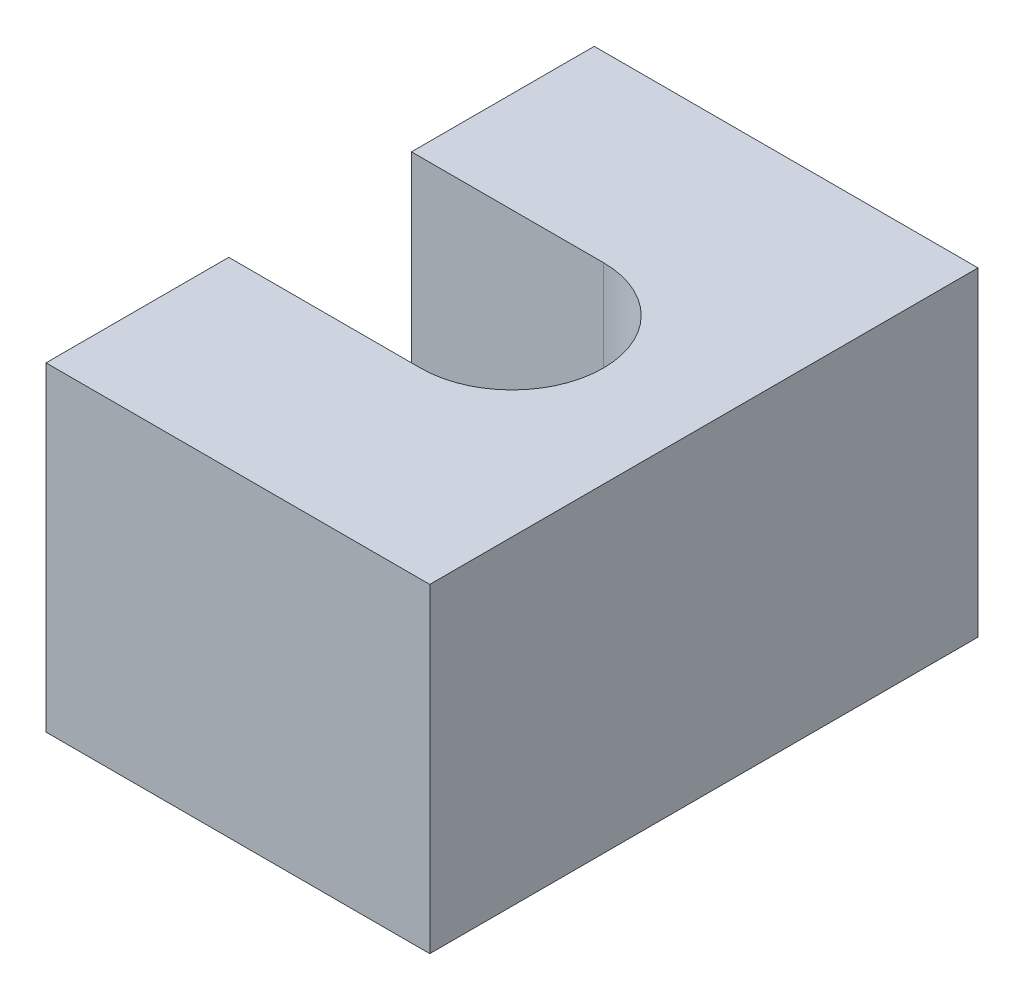
ISO-10303-21;
HEADER;
FILE_DESCRIPTION(('STEP AP214'),'2;1');
FILE_NAME('part.step','',(''),(''),'','','');
FILE_SCHEMA(('AUTOMOTIVE_DESIGN { 1 0 10303 214 1 1 1 1 }'));
ENDSEC;
DATA;
#1=APPLICATION_CONTEXT('core data for automotive mechanical design processes');
#2=APPLICATION_PROTOCOL_DEFINITION('international standard','automotive_design',2000,#1);
#3=PRODUCT_CONTEXT('',#1,'mechanical');
#4=PRODUCT('Part','Part','',(#3));
#5=PRODUCT_RELATED_PRODUCT_CATEGORY('part','',(#4));
#6=PRODUCT_DEFINITION_FORMATION('','',#4);
#7=PRODUCT_DEFINITION_CONTEXT('part definition',#1,'design');
#8=PRODUCT_DEFINITION('design','',#6,#7);
#9=PRODUCT_DEFINITION_SHAPE('','',#8);
#10=(LENGTH_UNIT() NAMED_UNIT(*) SI_UNIT(.MILLI.,.METRE.));
#11=(NAMED_UNIT(*) PLANE_ANGLE_UNIT() SI_UNIT($,.RADIAN.));
#12=(NAMED_UNIT(*) SI_UNIT($,.STERADIAN.) SOLID_ANGLE_UNIT());
#13=UNCERTAINTY_MEASURE_WITH_UNIT(LENGTH_MEASURE(1.E-05),#10,'distance_accuracy_value','');
#14=(GEOMETRIC_REPRESENTATION_CONTEXT(3) GLOBAL_UNCERTAINTY_ASSIGNED_CONTEXT((#13)) GLOBAL_UNIT_ASSIGNED_CONTEXT((#10,
#11,#12)) REPRESENTATION_CONTEXT('',''));
#15=CARTESIAN_POINT('',(0.,0.,0.));
#16=DIRECTION('',(0.,0.,1.));
#17=DIRECTION('',(1.,0.,0.));
#18=AXIS2_PLACEMENT_3D('',#15,#16,#17);
#19=CARTESIAN_POINT('',(0.,10.,0.));
#20=DIRECTION('',(0.,-1.,0.));
#21=DIRECTION('',(0.,0.,-1.));
#22=AXIS2_PLACEMENT_3D('',#19,#20,#21);
#23=PLANE('',#22);
#24=CARTESIAN_POINT('',(20.85,10.,-30.));
#25=DIRECTION('',(0.,1.,0.));
#26=DIRECTION('',(0.,0.,1.));
#27=AXIS2_PLACEMENT_3D('',#24,#25,#26);
#28=CIRCLE('',#27,2.5);
#29=CARTESIAN_POINT('',(20.85,10.,-27.5));
#30=VERTEX_POINT('',#29);
#31=EDGE_CURVE('E339',#30,#30,#28,.T.);
#32=ORIENTED_EDGE('',*,*,#31,.F.);
#33=EDGE_LOOP('',(#32));
#34=FACE_BOUND('',#33,.T.);
#35=DIRECTION('',(-1.,0.,0.));
#36=VECTOR('',#35,1.);
#37=CARTESIAN_POINT('',(0.,10.,-20.));
#38=LINE('',#37,#36);
#39=CARTESIAN_POINT('',(21.,10.,-20.));
#40=VERTEX_POINT('',#39);
#41=CARTESIAN_POINT('',(0.,10.,-20.));
#42=VERTEX_POINT('',#41);
#43=EDGE_CURVE('E51',#40,#42,#38,.T.);
#44=ORIENTED_EDGE('',*,*,#43,.F.);
#45=CARTESIAN_POINT('',(21.,10.,-30.));
#46=DIRECTION('',(0.,-1.,0.));
#47=DIRECTION('',(0.,0.,1.));
#48=AXIS2_PLACEMENT_3D('',#45,#46,#47);
#49=CIRCLE('',#48,10.);
#50=CARTESIAN_POINT('',(21.,10.,-40.));
#51=VERTEX_POINT('',#50);
#52=EDGE_CURVE('E121',#51,#40,#49,.T.);
#53=ORIENTED_EDGE('',*,*,#52,.F.);
#54=DIRECTION('',(1.,0.,0.));
#55=VECTOR('',#54,1.);
#56=CARTESIAN_POINT('',(0.,10.,-40.));
#57=LINE('',#56,#55);
#58=CARTESIAN_POINT('',(0.,10.,-40.));
#59=VERTEX_POINT('',#58);
#60=EDGE_CURVE('E139',#59,#51,#57,.T.);
#61=ORIENTED_EDGE('',*,*,#60,.F.);
#62=DIRECTION('',(0.,0.,1.));
#63=VECTOR('',#62,1.);
#64=CARTESIAN_POINT('',(0.,10.,0.));
#65=LINE('',#64,#63);
#66=EDGE_CURVE('E56',#59,#42,#65,.T.);
#67=ORIENTED_EDGE('',*,*,#66,.T.);
#68=EDGE_LOOP('',(#44,#53,#61,#67));
#69=FACE_BOUND('',#68,.T.);
#70=ADVANCED_FACE('F35',(#34,#69),#23,.F.);
#71=CARTESIAN_POINT('',(0.,10.,0.));
#72=DIRECTION('',(1.,0.,0.));
#73=DIRECTION('',(0.,0.,-1.));
#74=AXIS2_PLACEMENT_3D('',#71,#72,#73);
#75=PLANE('',#74);
#76=CARTESIAN_POINT('',(0.,22.5,-10.));
#77=DIRECTION('',(-1.,0.,0.));
#78=DIRECTION('',(0.,0.,1.));
#79=AXIS2_PLACEMENT_3D('',#76,#77,#78);
#80=CIRCLE('',#79,4.);
#81=CARTESIAN_POINT('',(0.,22.5,-6.));
#82=VERTEX_POINT('',#81);
#83=EDGE_CURVE('E344',#82,#82,#80,.T.);
#84=ORIENTED_EDGE('',*,*,#83,.F.);
#85=EDGE_LOOP('',(#84));
#86=FACE_BOUND('',#85,.T.);
#87=CARTESIAN_POINT('',(0.,22.5,-50.));
#88=DIRECTION('',(-1.,0.,0.));
#89=DIRECTION('',(0.,0.,-1.));
#90=AXIS2_PLACEMENT_3D('',#87,#88,#89);
#91=CIRCLE('',#90,4.);
#92=CARTESIAN_POINT('',(0.,22.5,-54.));
#93=VERTEX_POINT('',#92);
#94=EDGE_CURVE('E124',#93,#93,#91,.T.);
#95=ORIENTED_EDGE('',*,*,#94,.F.);
#96=EDGE_LOOP('',(#95));
#97=FACE_BOUND('',#96,.T.);
#98=DIRECTION('',(0.,0.,1.));
#99=VECTOR('',#98,1.);
#100=CARTESIAN_POINT('',(0.,0.,0.));
#101=LINE('',#100,#99);
#102=CARTESIAN_POINT('',(0.,0.,-60.));
#103=VERTEX_POINT('',#102);
#104=CARTESIAN_POINT('',(0.,0.,0.));
#105=VERTEX_POINT('',#104);
#106=EDGE_CURVE('E105',#103,#105,#101,.T.);
#107=ORIENTED_EDGE('',*,*,#106,.T.);
#108=DIRECTION('',(0.,-1.,0.));
#109=VECTOR('',#108,1.);
#110=CARTESIAN_POINT('',(0.,10.,0.));
#111=LINE('',#110,#109);
#112=CARTESIAN_POINT('',(0.,35.,0.));
#113=VERTEX_POINT('',#112);
#114=EDGE_CURVE('E11',#113,#105,#111,.T.);
#115=ORIENTED_EDGE('',*,*,#114,.F.);
#116=DIRECTION('',(0.,0.,1.));
#117=VECTOR('',#116,1.);
#118=CARTESIAN_POINT('',(0.,35.,-20.));
#119=LINE('',#118,#117);
#120=CARTESIAN_POINT('',(0.,35.,-20.));
#121=VERTEX_POINT('',#120);
#122=EDGE_CURVE('E102',#121,#113,#119,.T.);
#123=ORIENTED_EDGE('',*,*,#122,.F.);
#124=DIRECTION('',(0.,-1.,0.));
#125=VECTOR('',#124,1.);
#126=CARTESIAN_POINT('',(0.,35.,-20.));
#127=LINE('',#126,#125);
#128=EDGE_CURVE('E138',#121,#42,#127,.T.);
#129=ORIENTED_EDGE('',*,*,#128,.T.);
#130=ORIENTED_EDGE('',*,*,#66,.F.);
#131=DIRECTION('',(0.,-1.,0.));
#132=VECTOR('',#131,1.);
#133=CARTESIAN_POINT('',(0.,35.,-40.));
#134=LINE('',#133,#132);
#135=CARTESIAN_POINT('',(0.,35.,-40.));
#136=VERTEX_POINT('',#135);
#137=EDGE_CURVE('E151',#136,#59,#134,.T.);
#138=ORIENTED_EDGE('',*,*,#137,.F.);
#139=DIRECTION('',(0.,0.,1.));
#140=VECTOR('',#139,1.);
#141=CARTESIAN_POINT('',(0.,35.,-40.));
#142=LINE('',#141,#140);
#143=CARTESIAN_POINT('',(0.,35.,-60.));
#144=VERTEX_POINT('',#143);
#145=EDGE_CURVE('E131',#144,#136,#142,.T.);
#146=ORIENTED_EDGE('',*,*,#145,.F.);
#147=DIRECTION('',(0.,-1.,0.));
#148=VECTOR('',#147,1.);
#149=CARTESIAN_POINT('',(0.,10.,-60.));
#150=LINE('',#149,#148);
#151=EDGE_CURVE('E155',#144,#103,#150,.T.);
#152=ORIENTED_EDGE('',*,*,#151,.T.);
#153=EDGE_LOOP('',(#107,#115,#123,#129,#130,#138,#146,#152));
#154=FACE_BOUND('',#153,.T.);
#155=ADVANCED_FACE('F37',(#86,#97,#154),#75,.F.);
#156=CARTESIAN_POINT('',(0.,10.,0.));
#157=DIRECTION('',(0.,0.,-1.));
#158=DIRECTION('',(-1.,0.,0.));
#159=AXIS2_PLACEMENT_3D('',#156,#157,#158);
#160=PLANE('',#159);
#161=DIRECTION('',(1.,0.,0.));
#162=VECTOR('',#161,1.);
#163=CARTESIAN_POINT('',(0.,0.,0.));
#164=LINE('',#163,#162);
#165=CARTESIAN_POINT('',(42.,0.,0.));
#166=VERTEX_POINT('',#165);
#167=EDGE_CURVE('E158',#105,#166,#164,.T.);
#168=ORIENTED_EDGE('',*,*,#167,.T.);
#169=DIRECTION('',(0.,-1.,0.));
#170=VECTOR('',#169,1.);
#171=CARTESIAN_POINT('',(42.,10.,0.));
#172=LINE('',#171,#170);
#173=CARTESIAN_POINT('',(42.,35.,0.));
#174=VERTEX_POINT('',#173);
#175=EDGE_CURVE('E44',#174,#166,#172,.T.);
#176=ORIENTED_EDGE('',*,*,#175,.F.);
#177=DIRECTION('',(1.,0.,0.));
#178=VECTOR('',#177,1.);
#179=CARTESIAN_POINT('',(0.,35.,0.));
#180=LINE('',#179,#178);
#181=EDGE_CURVE('E108',#113,#174,#180,.T.);
#182=ORIENTED_EDGE('',*,*,#181,.F.);
#183=ORIENTED_EDGE('',*,*,#114,.T.);
#184=EDGE_LOOP('',(#168,#176,#182,#183));
#185=FACE_BOUND('',#184,.T.);
#186=ADVANCED_FACE('F109',(#185),#160,.F.);
#187=CARTESIAN_POINT('',(42.,10.,0.));
#188=DIRECTION('',(-1.,0.,0.));
#189=DIRECTION('',(0.,0.,1.));
#190=AXIS2_PLACEMENT_3D('',#187,#188,#189);
#191=PLANE('',#190);
#192=DIRECTION('',(0.,0.,-1.));
#193=VECTOR('',#192,1.);
#194=CARTESIAN_POINT('',(42.,0.,0.));
#195=LINE('',#194,#193);
#196=CARTESIAN_POINT('',(42.,0.,-60.));
#197=VERTEX_POINT('',#196);
#198=EDGE_CURVE('E160',#166,#197,#195,.T.);
#199=ORIENTED_EDGE('',*,*,#198,.T.);
#200=DIRECTION('',(0.,-1.,0.));
#201=VECTOR('',#200,1.);
#202=CARTESIAN_POINT('',(42.,10.,-60.));
#203=LINE('',#202,#201);
#204=CARTESIAN_POINT('',(42.,35.,-60.));
#205=VERTEX_POINT('',#204);
#206=EDGE_CURVE('E164',#205,#197,#203,.T.);
#207=ORIENTED_EDGE('',*,*,#206,.F.);
#208=DIRECTION('',(0.,0.,-1.));
#209=VECTOR('',#208,1.);
#210=CARTESIAN_POINT('',(42.,35.,0.));
#211=LINE('',#210,#209);
#212=EDGE_CURVE('E114',#174,#205,#211,.T.);
#213=ORIENTED_EDGE('',*,*,#212,.F.);
#214=ORIENTED_EDGE('',*,*,#175,.T.);
#215=EDGE_LOOP('',(#199,#207,#213,#214));
#216=FACE_BOUND('',#215,.T.);
#217=ADVANCED_FACE('F169',(#216),#191,.F.);
#218=CARTESIAN_POINT('',(0.,10.,-60.));
#219=DIRECTION('',(0.,0.,1.));
#220=DIRECTION('',(1.,0.,0.));
#221=AXIS2_PLACEMENT_3D('',#218,#219,#220);
#222=PLANE('',#221);
#223=DIRECTION('',(-1.,0.,0.));
#224=VECTOR('',#223,1.);
#225=CARTESIAN_POINT('',(0.,0.,-60.));
#226=LINE('',#225,#224);
#227=EDGE_CURVE('E156',#197,#103,#226,.T.);
#228=ORIENTED_EDGE('',*,*,#227,.T.);
#229=ORIENTED_EDGE('',*,*,#151,.F.);
#230=DIRECTION('',(-1.,0.,0.));
#231=VECTOR('',#230,1.);
#232=CARTESIAN_POINT('',(0.,35.,-60.));
#233=LINE('',#232,#231);
#234=EDGE_CURVE('E128',#205,#144,#233,.T.);
#235=ORIENTED_EDGE('',*,*,#234,.F.);
#236=ORIENTED_EDGE('',*,*,#206,.T.);
#237=EDGE_LOOP('',(#228,#229,#235,#236));
#238=FACE_BOUND('',#237,.T.);
#239=ADVANCED_FACE('F174',(#238),#222,.F.);
#240=CARTESIAN_POINT('',(0.,0.,0.));
#241=DIRECTION('',(0.,-1.,0.));
#242=DIRECTION('',(0.,0.,-1.));
#243=AXIS2_PLACEMENT_3D('',#240,#241,#242);
#244=PLANE('',#243);
#245=CARTESIAN_POINT('',(20.85,0.,-30.));
#246=DIRECTION('',(0.,-1.,0.));
#247=DIRECTION('',(0.,0.,-1.));
#248=AXIS2_PLACEMENT_3D('',#245,#246,#247);
#249=CIRCLE('',#248,2.5);
#250=CARTESIAN_POINT('',(20.85,0.,-32.5));
#251=VERTEX_POINT('',#250);
#252=EDGE_CURVE('E39',#251,#251,#249,.T.);
#253=ORIENTED_EDGE('',*,*,#252,.F.);
#254=EDGE_LOOP('',(#253));
#255=FACE_BOUND('',#254,.T.);
#256=ORIENTED_EDGE('',*,*,#106,.F.);
#257=ORIENTED_EDGE('',*,*,#227,.F.);
#258=ORIENTED_EDGE('',*,*,#198,.F.);
#259=ORIENTED_EDGE('',*,*,#167,.F.);
#260=EDGE_LOOP('',(#256,#257,#258,#259));
#261=FACE_BOUND('',#260,.T.);
#262=ADVANCED_FACE('F172',(#255,#261),#244,.T.);
#263=CARTESIAN_POINT('',(0.,35.,-40.));
#264=DIRECTION('',(0.,0.,-1.));
#265=DIRECTION('',(-1.,0.,0.));
#266=AXIS2_PLACEMENT_3D('',#263,#264,#265);
#267=PLANE('',#266);
#268=ORIENTED_EDGE('',*,*,#60,.T.);
#269=DIRECTION('',(0.,-1.,0.));
#270=VECTOR('',#269,1.);
#271=CARTESIAN_POINT('',(21.,35.,-40.));
#272=LINE('',#271,#270);
#273=CARTESIAN_POINT('',(21.,35.,-40.));
#274=VERTEX_POINT('',#273);
#275=EDGE_CURVE('E148',#274,#51,#272,.T.);
#276=ORIENTED_EDGE('',*,*,#275,.F.);
#277=DIRECTION('',(1.,0.,0.));
#278=VECTOR('',#277,1.);
#279=CARTESIAN_POINT('',(0.,35.,-40.));
#280=LINE('',#279,#278);
#281=EDGE_CURVE('E133',#136,#274,#280,.T.);
#282=ORIENTED_EDGE('',*,*,#281,.F.);
#283=ORIENTED_EDGE('',*,*,#137,.T.);
#284=EDGE_LOOP('',(#268,#276,#282,#283));
#285=FACE_BOUND('',#284,.T.);
#286=ADVANCED_FACE('F183',(#285),#267,.F.);
#287=CARTESIAN_POINT('',(21.,35.,-30.));
#288=DIRECTION('',(0.,-1.,0.));
#289=DIRECTION('',(0.,0.,-1.));
#290=AXIS2_PLACEMENT_3D('',#287,#288,#289);
#291=CYLINDRICAL_SURFACE('',#290,10.);
#292=ORIENTED_EDGE('',*,*,#52,.T.);
#293=DIRECTION('',(0.,-1.,0.));
#294=VECTOR('',#293,1.);
#295=CARTESIAN_POINT('',(21.,35.,-20.));
#296=LINE('',#295,#294);
#297=CARTESIAN_POINT('',(21.,35.,-20.));
#298=VERTEX_POINT('',#297);
#299=EDGE_CURVE('E145',#298,#40,#296,.T.);
#300=ORIENTED_EDGE('',*,*,#299,.F.);
#301=CARTESIAN_POINT('',(21.,35.,-30.));
#302=DIRECTION('',(0.,-1.,0.));
#303=DIRECTION('',(0.,0.,1.));
#304=AXIS2_PLACEMENT_3D('',#301,#302,#303);
#305=CIRCLE('',#304,10.);
#306=EDGE_CURVE('E135',#274,#298,#305,.T.);
#307=ORIENTED_EDGE('',*,*,#306,.F.);
#308=ORIENTED_EDGE('',*,*,#275,.T.);
#309=EDGE_LOOP('',(#292,#300,#307,#308));
#310=FACE_BOUND('',#309,.T.);
#311=ADVANCED_FACE('F185',(#310),#291,.F.);
#312=CARTESIAN_POINT('',(0.,35.,-20.));
#313=DIRECTION('',(0.,0.,1.));
#314=DIRECTION('',(1.,0.,0.));
#315=AXIS2_PLACEMENT_3D('',#312,#313,#314);
#316=PLANE('',#315);
#317=ORIENTED_EDGE('',*,*,#43,.T.);
#318=ORIENTED_EDGE('',*,*,#128,.F.);
#319=DIRECTION('',(-1.,0.,0.));
#320=VECTOR('',#319,1.);
#321=CARTESIAN_POINT('',(0.,35.,-20.));
#322=LINE('',#321,#320);
#323=EDGE_CURVE('E118',#298,#121,#322,.T.);
#324=ORIENTED_EDGE('',*,*,#323,.F.);
#325=ORIENTED_EDGE('',*,*,#299,.T.);
#326=EDGE_LOOP('',(#317,#318,#324,#325));
#327=FACE_BOUND('',#326,.T.);
#328=ADVANCED_FACE('F187',(#327),#316,.F.);
#329=CARTESIAN_POINT('',(21.,35.,-30.));
#330=DIRECTION('',(0.,1.,0.));
#331=DIRECTION('',(0.,0.,1.));
#332=AXIS2_PLACEMENT_3D('',#329,#330,#331);
#333=PLANE('',#332);
#334=ORIENTED_EDGE('',*,*,#122,.T.);
#335=ORIENTED_EDGE('',*,*,#181,.T.);
#336=ORIENTED_EDGE('',*,*,#212,.T.);
#337=ORIENTED_EDGE('',*,*,#234,.T.);
#338=ORIENTED_EDGE('',*,*,#145,.T.);
#339=ORIENTED_EDGE('',*,*,#281,.T.);
#340=ORIENTED_EDGE('',*,*,#306,.T.);
#341=ORIENTED_EDGE('',*,*,#323,.T.);
#342=EDGE_LOOP('',(#334,#335,#336,#337,#338,#339,#340,#341));
#343=FACE_BOUND('',#342,.T.);
#344=ADVANCED_FACE('F116',(#343),#333,.T.);
#345=CARTESIAN_POINT('',(15.,22.5,-50.));
#346=DIRECTION('',(-1.,0.,0.));
#347=DIRECTION('',(0.,0.,1.));
#348=AXIS2_PLACEMENT_3D('',#345,#346,#347);
#349=CYLINDRICAL_SURFACE('',#348,4.);
#350=CARTESIAN_POINT('',(15.,22.5,-50.));
#351=DIRECTION('',(-1.,0.,0.));
#352=DIRECTION('',(0.,0.,-1.));
#353=AXIS2_PLACEMENT_3D('',#350,#351,#352);
#354=CIRCLE('',#353,4.);
#355=CARTESIAN_POINT('',(15.,22.5,-54.));
#356=VERTEX_POINT('',#355);
#357=EDGE_CURVE('E346',#356,#356,#354,.T.);
#358=ORIENTED_EDGE('',*,*,#357,.F.);
#359=EDGE_LOOP('',(#358));
#360=FACE_BOUND('',#359,.T.);
#361=ORIENTED_EDGE('',*,*,#94,.T.);
#362=EDGE_LOOP('',(#361));
#363=FACE_BOUND('',#362,.T.);
#364=ADVANCED_FACE('F194',(#360,#363),#349,.F.);
#365=CARTESIAN_POINT('',(15.,22.5,-50.));
#366=DIRECTION('',(1.,0.,0.));
#367=DIRECTION('',(0.,0.,-1.));
#368=AXIS2_PLACEMENT_3D('',#365,#366,#367);
#369=PLANE('',#368);
#370=ORIENTED_EDGE('',*,*,#357,.T.);
#371=EDGE_LOOP('',(#370));
#372=FACE_BOUND('',#371,.T.);
#373=ADVANCED_FACE('F264',(#372),#369,.F.);
#374=CARTESIAN_POINT('',(15.,22.5,-10.));
#375=DIRECTION('',(-1.,0.,0.));
#376=DIRECTION('',(0.,0.,1.));
#377=AXIS2_PLACEMENT_3D('',#374,#375,#376);
#378=CYLINDRICAL_SURFACE('',#377,4.);
#379=CARTESIAN_POINT('',(15.,22.5,-10.));
#380=DIRECTION('',(-1.,0.,0.));
#381=DIRECTION('',(0.,0.,1.));
#382=AXIS2_PLACEMENT_3D('',#379,#380,#381);
#383=CIRCLE('',#382,4.);
#384=CARTESIAN_POINT('',(15.,22.5,-6.));
#385=VERTEX_POINT('',#384);
#386=EDGE_CURVE('E142',#385,#385,#383,.T.);
#387=ORIENTED_EDGE('',*,*,#386,.F.);
#388=EDGE_LOOP('',(#387));
#389=FACE_BOUND('',#388,.T.);
#390=ORIENTED_EDGE('',*,*,#83,.T.);
#391=EDGE_LOOP('',(#390));
#392=FACE_BOUND('',#391,.T.);
#393=ADVANCED_FACE('F274',(#389,#392),#378,.F.);
#394=CARTESIAN_POINT('',(15.,22.5,-10.));
#395=DIRECTION('',(-1.,0.,0.));
#396=DIRECTION('',(0.,0.,1.));
#397=AXIS2_PLACEMENT_3D('',#394,#395,#396);
#398=PLANE('',#397);
#399=ORIENTED_EDGE('',*,*,#386,.T.);
#400=EDGE_LOOP('',(#399));
#401=FACE_BOUND('',#400,.T.);
#402=ADVANCED_FACE('F284',(#401),#398,.T.);
#403=CARTESIAN_POINT('',(20.85,-5.,-30.));
#404=DIRECTION('',(0.,1.,0.));
#405=DIRECTION('',(0.,0.,1.));
#406=AXIS2_PLACEMENT_3D('',#403,#404,#405);
#407=CYLINDRICAL_SURFACE('',#406,2.5);
#408=ORIENTED_EDGE('',*,*,#252,.T.);
#409=EDGE_LOOP('',(#408));
#410=FACE_BOUND('',#409,.T.);
#411=ORIENTED_EDGE('',*,*,#31,.T.);
#412=EDGE_LOOP('',(#411));
#413=FACE_BOUND('',#412,.T.);
#414=ADVANCED_FACE('F293',(#410,#413),#407,.F.);
#415=CLOSED_SHELL('',(#70,#155,#186,#217,#239,#262,#286,#311,#328,#344,#364,#373,#393,#402,#414));
#416=MANIFOLD_SOLID_BREP('B2',#415);
#417=ADVANCED_BREP_SHAPE_REPRESENTATION('',(#18,#416),#14);
#418=SHAPE_DEFINITION_REPRESENTATION(#9,#417);
ENDSEC;
END-ISO-10303-21;
